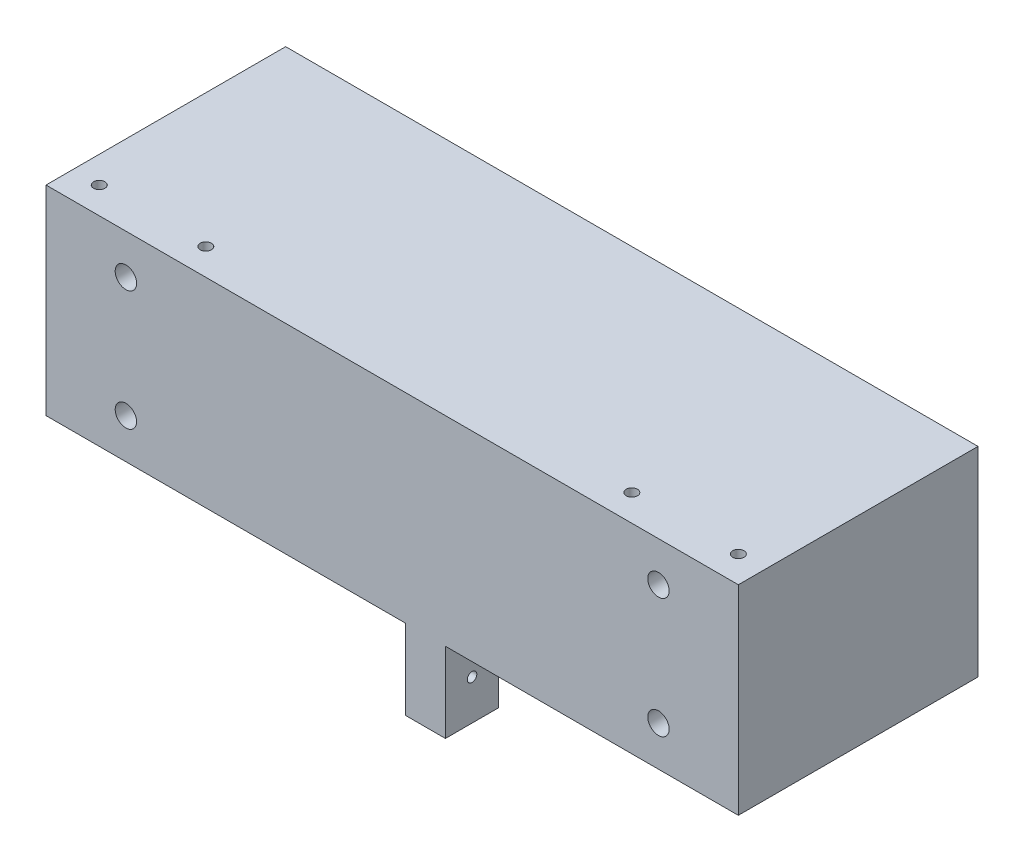
ISO-10303-21;
HEADER;
FILE_DESCRIPTION(('STEP AP214'),'2;1');
FILE_NAME('part.step','',(''),(''),'','','');
FILE_SCHEMA(('AUTOMOTIVE_DESIGN { 1 0 10303 214 1 1 1 1 }'));
ENDSEC;
DATA;
#1=APPLICATION_CONTEXT('core data for automotive mechanical design processes');
#2=APPLICATION_PROTOCOL_DEFINITION('international standard','automotive_design',2000,#1);
#3=PRODUCT_CONTEXT('',#1,'mechanical');
#4=PRODUCT('Part','Part','',(#3));
#5=PRODUCT_RELATED_PRODUCT_CATEGORY('part','',(#4));
#6=PRODUCT_DEFINITION_FORMATION('','',#4);
#7=PRODUCT_DEFINITION_CONTEXT('part definition',#1,'design');
#8=PRODUCT_DEFINITION('design','',#6,#7);
#9=PRODUCT_DEFINITION_SHAPE('','',#8);
#10=(LENGTH_UNIT() NAMED_UNIT(*) SI_UNIT(.MILLI.,.METRE.));
#11=(NAMED_UNIT(*) PLANE_ANGLE_UNIT() SI_UNIT($,.RADIAN.));
#12=(NAMED_UNIT(*) SI_UNIT($,.STERADIAN.) SOLID_ANGLE_UNIT());
#13=UNCERTAINTY_MEASURE_WITH_UNIT(LENGTH_MEASURE(1.E-05),#10,'distance_accuracy_value','');
#14=(GEOMETRIC_REPRESENTATION_CONTEXT(3) GLOBAL_UNCERTAINTY_ASSIGNED_CONTEXT((#13)) GLOBAL_UNIT_ASSIGNED_CONTEXT((#10,
#11,#12)) REPRESENTATION_CONTEXT('',''));
#15=CARTESIAN_POINT('',(0.,0.,0.));
#16=DIRECTION('',(0.,0.,1.));
#17=DIRECTION('',(1.,0.,0.));
#18=AXIS2_PLACEMENT_3D('',#15,#16,#17);
#19=CARTESIAN_POINT('',(-82.55,47.625,28.575));
#20=DIRECTION('',(-1.,0.,0.));
#21=DIRECTION('',(0.,0.,1.));
#22=AXIS2_PLACEMENT_3D('',#19,#20,#21);
#23=PLANE('',#22);
#24=DIRECTION('',(0.,0.,-1.));
#25=VECTOR('',#24,1.);
#26=CARTESIAN_POINT('',(-82.55,0.,28.575));
#27=LINE('',#26,#25);
#28=CARTESIAN_POINT('',(-82.55,0.,28.575));
#29=VERTEX_POINT('',#28);
#30=CARTESIAN_POINT('',(-82.55,0.,-28.575));
#31=VERTEX_POINT('',#30);
#32=EDGE_CURVE('E160',#29,#31,#27,.T.);
#33=ORIENTED_EDGE('',*,*,#32,.F.);
#34=DIRECTION('',(0.,-1.,0.));
#35=VECTOR('',#34,1.);
#36=CARTESIAN_POINT('',(-82.55,47.625,28.575));
#37=LINE('',#36,#35);
#38=CARTESIAN_POINT('',(-82.55,47.625,28.575));
#39=VERTEX_POINT('',#38);
#40=EDGE_CURVE('E11',#39,#29,#37,.T.);
#41=ORIENTED_EDGE('',*,*,#40,.F.);
#42=DIRECTION('',(0.,0.,-1.));
#43=VECTOR('',#42,1.);
#44=CARTESIAN_POINT('',(-82.55,47.625,28.575));
#45=LINE('',#44,#43);
#46=CARTESIAN_POINT('',(-82.55,47.625,-28.575));
#47=VERTEX_POINT('',#46);
#48=EDGE_CURVE('E166',#39,#47,#45,.T.);
#49=ORIENTED_EDGE('',*,*,#48,.T.);
#50=DIRECTION('',(0.,-1.,0.));
#51=VECTOR('',#50,1.);
#52=CARTESIAN_POINT('',(-82.55,47.625,-28.575));
#53=LINE('',#52,#51);
#54=EDGE_CURVE('E93',#47,#31,#53,.T.);
#55=ORIENTED_EDGE('',*,*,#54,.T.);
#56=EDGE_LOOP('',(#33,#41,#49,#55));
#57=FACE_BOUND('',#56,.T.);
#58=ADVANCED_FACE('F43',(#57),#23,.T.);
#59=CARTESIAN_POINT('',(-82.55,47.625,28.575));
#60=DIRECTION('',(0.,0.,-1.));
#61=DIRECTION('',(-1.,0.,0.));
#62=AXIS2_PLACEMENT_3D('',#59,#60,#61);
#63=PLANE('',#62);
#64=CARTESIAN_POINT('',(-63.5,38.1,28.575));
#65=DIRECTION('',(0.,0.,1.));
#66=DIRECTION('',(1.,0.,0.));
#67=AXIS2_PLACEMENT_3D('',#64,#65,#66);
#68=CIRCLE('',#67,2.55269999999999);
#69=CARTESIAN_POINT('',(-60.9473,38.1,28.575));
#70=VERTEX_POINT('',#69);
#71=EDGE_CURVE('E203',#70,#70,#68,.T.);
#72=ORIENTED_EDGE('',*,*,#71,.F.);
#73=EDGE_LOOP('',(#72));
#74=FACE_BOUND('',#73,.T.);
#75=CARTESIAN_POINT('',(-63.5,9.525,28.575));
#76=DIRECTION('',(0.,0.,1.));
#77=DIRECTION('',(1.,0.,0.));
#78=AXIS2_PLACEMENT_3D('',#75,#76,#77);
#79=CIRCLE('',#78,2.55269999999999);
#80=CARTESIAN_POINT('',(-60.9473,9.525,28.575));
#81=VERTEX_POINT('',#80);
#82=EDGE_CURVE('E225',#81,#81,#79,.T.);
#83=ORIENTED_EDGE('',*,*,#82,.F.);
#84=EDGE_LOOP('',(#83));
#85=FACE_BOUND('',#84,.T.);
#86=CARTESIAN_POINT('',(63.5,38.1,28.575));
#87=DIRECTION('',(0.,0.,1.));
#88=DIRECTION('',(1.,0.,0.));
#89=AXIS2_PLACEMENT_3D('',#86,#87,#88);
#90=CIRCLE('',#89,2.55269999999999);
#91=CARTESIAN_POINT('',(66.0527,38.1,28.575));
#92=VERTEX_POINT('',#91);
#93=EDGE_CURVE('E233',#92,#92,#90,.T.);
#94=ORIENTED_EDGE('',*,*,#93,.F.);
#95=EDGE_LOOP('',(#94));
#96=FACE_BOUND('',#95,.T.);
#97=CARTESIAN_POINT('',(63.5,9.525,28.575));
#98=DIRECTION('',(0.,0.,1.));
#99=DIRECTION('',(1.,0.,0.));
#100=AXIS2_PLACEMENT_3D('',#97,#98,#99);
#101=CIRCLE('',#100,2.55269999999999);
#102=CARTESIAN_POINT('',(66.0527,9.525,28.575));
#103=VERTEX_POINT('',#102);
#104=EDGE_CURVE('E241',#103,#103,#101,.T.);
#105=ORIENTED_EDGE('',*,*,#104,.F.);
#106=EDGE_LOOP('',(#105));
#107=FACE_BOUND('',#106,.T.);
#108=DIRECTION('',(1.,0.,0.));
#109=VECTOR('',#108,1.);
#110=CARTESIAN_POINT('',(-82.55,0.,28.575));
#111=LINE('',#110,#109);
#112=CARTESIAN_POINT('',(3.175,0.,28.575));
#113=VERTEX_POINT('',#112);
#114=EDGE_CURVE('E170',#29,#113,#111,.T.);
#115=ORIENTED_EDGE('',*,*,#114,.T.);
#116=DIRECTION('',(0.,-1.,0.));
#117=VECTOR('',#116,1.);
#118=CARTESIAN_POINT('',(3.175,0.,28.575));
#119=LINE('',#118,#117);
#120=CARTESIAN_POINT('',(3.175,-19.05,28.575));
#121=VERTEX_POINT('',#120);
#122=EDGE_CURVE('E60',#113,#121,#119,.T.);
#123=ORIENTED_EDGE('',*,*,#122,.T.);
#124=DIRECTION('',(1.,0.,0.));
#125=VECTOR('',#124,1.);
#126=CARTESIAN_POINT('',(3.175,-19.05,28.575));
#127=LINE('',#126,#125);
#128=CARTESIAN_POINT('',(12.7,-19.05,28.575));
#129=VERTEX_POINT('',#128);
#130=EDGE_CURVE('E122',#121,#129,#127,.T.);
#131=ORIENTED_EDGE('',*,*,#130,.T.);
#132=DIRECTION('',(0.,-1.,0.));
#133=VECTOR('',#132,1.);
#134=CARTESIAN_POINT('',(12.7,0.,28.575));
#135=LINE('',#134,#133);
#136=CARTESIAN_POINT('',(12.7,0.,28.575));
#137=VERTEX_POINT('',#136);
#138=EDGE_CURVE('E141',#137,#129,#135,.T.);
#139=ORIENTED_EDGE('',*,*,#138,.F.);
#140=CARTESIAN_POINT('',(82.55,0.,28.575));
#141=VERTEX_POINT('',#140);
#142=EDGE_CURVE('E190',#137,#141,#111,.T.);
#143=ORIENTED_EDGE('',*,*,#142,.T.);
#144=DIRECTION('',(0.,-1.,0.));
#145=VECTOR('',#144,1.);
#146=CARTESIAN_POINT('',(82.55,47.625,28.575));
#147=LINE('',#146,#145);
#148=CARTESIAN_POINT('',(82.55,47.625,28.575));
#149=VERTEX_POINT('',#148);
#150=EDGE_CURVE('E52',#149,#141,#147,.T.);
#151=ORIENTED_EDGE('',*,*,#150,.F.);
#152=DIRECTION('',(1.,0.,0.));
#153=VECTOR('',#152,1.);
#154=CARTESIAN_POINT('',(-82.55,47.625,28.575));
#155=LINE('',#154,#153);
#156=EDGE_CURVE('E176',#39,#149,#155,.T.);
#157=ORIENTED_EDGE('',*,*,#156,.F.);
#158=ORIENTED_EDGE('',*,*,#40,.T.);
#159=EDGE_LOOP('',(#115,#123,#131,#139,#143,#151,#157,#158));
#160=FACE_BOUND('',#159,.T.);
#161=ADVANCED_FACE('F275',(#74,#85,#96,#107,#160),#63,.F.);
#162=CARTESIAN_POINT('',(82.55,47.625,28.575));
#163=DIRECTION('',(-1.,0.,0.));
#164=DIRECTION('',(0.,0.,1.));
#165=AXIS2_PLACEMENT_3D('',#162,#163,#164);
#166=PLANE('',#165);
#167=DIRECTION('',(0.,0.,-1.));
#168=VECTOR('',#167,1.);
#169=CARTESIAN_POINT('',(82.55,0.,28.575));
#170=LINE('',#169,#168);
#171=CARTESIAN_POINT('',(82.55,0.,-28.575));
#172=VERTEX_POINT('',#171);
#173=EDGE_CURVE('E186',#141,#172,#170,.T.);
#174=ORIENTED_EDGE('',*,*,#173,.T.);
#175=DIRECTION('',(0.,-1.,0.));
#176=VECTOR('',#175,1.);
#177=CARTESIAN_POINT('',(82.55,47.625,-28.575));
#178=LINE('',#177,#176);
#179=CARTESIAN_POINT('',(82.55,47.625,-28.575));
#180=VERTEX_POINT('',#179);
#181=EDGE_CURVE('E196',#180,#172,#178,.T.);
#182=ORIENTED_EDGE('',*,*,#181,.F.);
#183=DIRECTION('',(0.,0.,-1.));
#184=VECTOR('',#183,1.);
#185=CARTESIAN_POINT('',(82.55,47.625,28.575));
#186=LINE('',#185,#184);
#187=EDGE_CURVE('E173',#149,#180,#186,.T.);
#188=ORIENTED_EDGE('',*,*,#187,.F.);
#189=ORIENTED_EDGE('',*,*,#150,.T.);
#190=EDGE_LOOP('',(#174,#182,#188,#189));
#191=FACE_BOUND('',#190,.T.);
#192=ADVANCED_FACE('F279',(#191),#166,.F.);
#193=CARTESIAN_POINT('',(-82.55,47.625,-28.575));
#194=DIRECTION('',(0.,0.,-1.));
#195=DIRECTION('',(-1.,0.,0.));
#196=AXIS2_PLACEMENT_3D('',#193,#194,#195);
#197=PLANE('',#196);
#198=CARTESIAN_POINT('',(-63.5,38.1,-28.575));
#199=DIRECTION('',(0.,0.,1.));
#200=DIRECTION('',(1.,0.,0.));
#201=AXIS2_PLACEMENT_3D('',#198,#199,#200);
#202=CIRCLE('',#201,2.55269999999999);
#203=CARTESIAN_POINT('',(-60.9473,38.1,-28.575));
#204=VERTEX_POINT('',#203);
#205=EDGE_CURVE('E210',#204,#204,#202,.T.);
#206=ORIENTED_EDGE('',*,*,#205,.T.);
#207=EDGE_LOOP('',(#206));
#208=FACE_BOUND('',#207,.T.);
#209=CARTESIAN_POINT('',(-63.5,9.525,-28.575));
#210=DIRECTION('',(0.,0.,1.));
#211=DIRECTION('',(1.,0.,0.));
#212=AXIS2_PLACEMENT_3D('',#209,#210,#211);
#213=CIRCLE('',#212,2.55269999999999);
#214=CARTESIAN_POINT('',(-60.9473,9.525,-28.575));
#215=VERTEX_POINT('',#214);
#216=EDGE_CURVE('E229',#215,#215,#213,.T.);
#217=ORIENTED_EDGE('',*,*,#216,.T.);
#218=EDGE_LOOP('',(#217));
#219=FACE_BOUND('',#218,.T.);
#220=CARTESIAN_POINT('',(63.5,38.1,-28.575));
#221=DIRECTION('',(0.,0.,1.));
#222=DIRECTION('',(1.,0.,0.));
#223=AXIS2_PLACEMENT_3D('',#220,#221,#222);
#224=CIRCLE('',#223,2.55269999999999);
#225=CARTESIAN_POINT('',(66.0527,38.1,-28.575));
#226=VERTEX_POINT('',#225);
#227=EDGE_CURVE('E237',#226,#226,#224,.T.);
#228=ORIENTED_EDGE('',*,*,#227,.T.);
#229=EDGE_LOOP('',(#228));
#230=FACE_BOUND('',#229,.T.);
#231=CARTESIAN_POINT('',(63.5,9.525,-28.575));
#232=DIRECTION('',(0.,0.,1.));
#233=DIRECTION('',(1.,0.,0.));
#234=AXIS2_PLACEMENT_3D('',#231,#232,#233);
#235=CIRCLE('',#234,2.55269999999999);
#236=CARTESIAN_POINT('',(66.0527,9.525,-28.575));
#237=VERTEX_POINT('',#236);
#238=EDGE_CURVE('E245',#237,#237,#235,.T.);
#239=ORIENTED_EDGE('',*,*,#238,.T.);
#240=EDGE_LOOP('',(#239));
#241=FACE_BOUND('',#240,.T.);
#242=DIRECTION('',(1.,0.,0.));
#243=VECTOR('',#242,1.);
#244=CARTESIAN_POINT('',(-82.55,0.,-28.575));
#245=LINE('',#244,#243);
#246=EDGE_CURVE('E182',#31,#172,#245,.T.);
#247=ORIENTED_EDGE('',*,*,#246,.F.);
#248=ORIENTED_EDGE('',*,*,#54,.F.);
#249=DIRECTION('',(1.,0.,0.));
#250=VECTOR('',#249,1.);
#251=CARTESIAN_POINT('',(-82.55,47.625,-28.575));
#252=LINE('',#251,#250);
#253=EDGE_CURVE('E169',#47,#180,#252,.T.);
#254=ORIENTED_EDGE('',*,*,#253,.T.);
#255=ORIENTED_EDGE('',*,*,#181,.T.);
#256=EDGE_LOOP('',(#247,#248,#254,#255));
#257=FACE_BOUND('',#256,.T.);
#258=ADVANCED_FACE('F295',(#208,#219,#230,#241,#257),#197,.T.);
#259=CARTESIAN_POINT('',(0.,47.625,0.));
#260=DIRECTION('',(0.,-1.,0.));
#261=DIRECTION('',(0.,0.,-1.));
#262=AXIS2_PLACEMENT_3D('',#259,#260,#261);
#263=PLANE('',#262);
#264=CARTESIAN_POINT('',(-76.2,47.625,22.225));
#265=DIRECTION('',(0.,1.,0.));
#266=DIRECTION('',(0.,0.,1.));
#267=AXIS2_PLACEMENT_3D('',#264,#265,#266);
#268=CIRCLE('',#267,1.35254999999999);
#269=CARTESIAN_POINT('',(-76.2,47.625,23.57755));
#270=VERTEX_POINT('',#269);
#271=EDGE_CURVE('E500',#270,#270,#268,.T.);
#272=ORIENTED_EDGE('',*,*,#271,.F.);
#273=EDGE_LOOP('',(#272));
#274=FACE_BOUND('',#273,.T.);
#275=CARTESIAN_POINT('',(-50.8,47.625,22.225));
#276=DIRECTION('',(0.,1.,0.));
#277=DIRECTION('',(0.,0.,1.));
#278=AXIS2_PLACEMENT_3D('',#275,#276,#277);
#279=CIRCLE('',#278,1.35255);
#280=CARTESIAN_POINT('',(-50.8,47.625,23.57755));
#281=VERTEX_POINT('',#280);
#282=EDGE_CURVE('E490',#281,#281,#279,.T.);
#283=ORIENTED_EDGE('',*,*,#282,.F.);
#284=EDGE_LOOP('',(#283));
#285=FACE_BOUND('',#284,.T.);
#286=CARTESIAN_POINT('',(50.8,47.625,22.225));
#287=DIRECTION('',(0.,1.,0.));
#288=DIRECTION('',(0.,0.,1.));
#289=AXIS2_PLACEMENT_3D('',#286,#287,#288);
#290=CIRCLE('',#289,1.35255);
#291=CARTESIAN_POINT('',(50.8,47.625,23.57755));
#292=VERTEX_POINT('',#291);
#293=EDGE_CURVE('E218',#292,#292,#290,.T.);
#294=ORIENTED_EDGE('',*,*,#293,.F.);
#295=EDGE_LOOP('',(#294));
#296=FACE_BOUND('',#295,.T.);
#297=CARTESIAN_POINT('',(76.2,47.625,22.225));
#298=DIRECTION('',(0.,1.,0.));
#299=DIRECTION('',(0.,0.,1.));
#300=AXIS2_PLACEMENT_3D('',#297,#298,#299);
#301=CIRCLE('',#300,1.35254999999999);
#302=CARTESIAN_POINT('',(76.2,47.625,23.57755));
#303=VERTEX_POINT('',#302);
#304=EDGE_CURVE('E204',#303,#303,#301,.T.);
#305=ORIENTED_EDGE('',*,*,#304,.F.);
#306=EDGE_LOOP('',(#305));
#307=FACE_BOUND('',#306,.T.);
#308=ORIENTED_EDGE('',*,*,#48,.F.);
#309=ORIENTED_EDGE('',*,*,#156,.T.);
#310=ORIENTED_EDGE('',*,*,#187,.T.);
#311=ORIENTED_EDGE('',*,*,#253,.F.);
#312=EDGE_LOOP('',(#308,#309,#310,#311));
#313=FACE_BOUND('',#312,.T.);
#314=ADVANCED_FACE('F269',(#274,#285,#296,#307,#313),#263,.F.);
#315=CARTESIAN_POINT('',(0.,0.,0.));
#316=DIRECTION('',(0.,-1.,0.));
#317=DIRECTION('',(0.,0.,-1.));
#318=AXIS2_PLACEMENT_3D('',#315,#316,#317);
#319=PLANE('',#318);
#320=CARTESIAN_POINT('',(-76.2,0.,22.225));
#321=DIRECTION('',(0.,-1.,0.));
#322=DIRECTION('',(0.,0.,-1.));
#323=AXIS2_PLACEMENT_3D('',#320,#321,#322);
#324=CIRCLE('',#323,1.35254999999999);
#325=CARTESIAN_POINT('',(-76.2,0.,20.87245));
#326=VERTEX_POINT('',#325);
#327=EDGE_CURVE('E494',#326,#326,#324,.T.);
#328=ORIENTED_EDGE('',*,*,#327,.F.);
#329=EDGE_LOOP('',(#328));
#330=FACE_BOUND('',#329,.T.);
#331=CARTESIAN_POINT('',(-50.8,0.,22.225));
#332=DIRECTION('',(0.,-1.,0.));
#333=DIRECTION('',(0.,0.,-1.));
#334=AXIS2_PLACEMENT_3D('',#331,#332,#333);
#335=CIRCLE('',#334,1.35254999999999);
#336=CARTESIAN_POINT('',(-50.8,0.,20.87245));
#337=VERTEX_POINT('',#336);
#338=EDGE_CURVE('E487',#337,#337,#335,.T.);
#339=ORIENTED_EDGE('',*,*,#338,.F.);
#340=EDGE_LOOP('',(#339));
#341=FACE_BOUND('',#340,.T.);
#342=CARTESIAN_POINT('',(50.8,0.,22.225));
#343=DIRECTION('',(0.,-1.,0.));
#344=DIRECTION('',(0.,0.,-1.));
#345=AXIS2_PLACEMENT_3D('',#342,#343,#344);
#346=CIRCLE('',#345,1.35254999999999);
#347=CARTESIAN_POINT('',(50.8,0.,20.87245));
#348=VERTEX_POINT('',#347);
#349=EDGE_CURVE('E46',#348,#348,#346,.T.);
#350=ORIENTED_EDGE('',*,*,#349,.F.);
#351=EDGE_LOOP('',(#350));
#352=FACE_BOUND('',#351,.T.);
#353=CARTESIAN_POINT('',(76.2,0.,22.225));
#354=DIRECTION('',(0.,-1.,0.));
#355=DIRECTION('',(0.,0.,-1.));
#356=AXIS2_PLACEMENT_3D('',#353,#354,#355);
#357=CIRCLE('',#356,1.35254999999999);
#358=CARTESIAN_POINT('',(76.2,0.,20.87245));
#359=VERTEX_POINT('',#358);
#360=EDGE_CURVE('E200',#359,#359,#357,.T.);
#361=ORIENTED_EDGE('',*,*,#360,.F.);
#362=EDGE_LOOP('',(#361));
#363=FACE_BOUND('',#362,.T.);
#364=DIRECTION('',(0.,0.,1.));
#365=VECTOR('',#364,1.);
#366=CARTESIAN_POINT('',(12.7,0.,15.875));
#367=LINE('',#366,#365);
#368=CARTESIAN_POINT('',(12.7,0.,15.875));
#369=VERTEX_POINT('',#368);
#370=EDGE_CURVE('E161',#369,#137,#367,.T.);
#371=ORIENTED_EDGE('',*,*,#370,.F.);
#372=DIRECTION('',(1.,0.,0.));
#373=VECTOR('',#372,1.);
#374=CARTESIAN_POINT('',(3.175,0.,15.875));
#375=LINE('',#374,#373);
#376=CARTESIAN_POINT('',(3.175,0.,15.875));
#377=VERTEX_POINT('',#376);
#378=EDGE_CURVE('E126',#377,#369,#375,.T.);
#379=ORIENTED_EDGE('',*,*,#378,.F.);
#380=DIRECTION('',(0.,0.,1.));
#381=VECTOR('',#380,1.);
#382=CARTESIAN_POINT('',(3.175,0.,15.875));
#383=LINE('',#382,#381);
#384=EDGE_CURVE('E139',#377,#113,#383,.T.);
#385=ORIENTED_EDGE('',*,*,#384,.T.);
#386=ORIENTED_EDGE('',*,*,#114,.F.);
#387=ORIENTED_EDGE('',*,*,#32,.T.);
#388=ORIENTED_EDGE('',*,*,#246,.T.);
#389=ORIENTED_EDGE('',*,*,#173,.F.);
#390=ORIENTED_EDGE('',*,*,#142,.F.);
#391=EDGE_LOOP('',(#371,#379,#385,#386,#387,#388,#389,#390));
#392=FACE_BOUND('',#391,.T.);
#393=ADVANCED_FACE('F261',(#330,#341,#352,#363,#392),#319,.T.);
#394=CARTESIAN_POINT('',(3.175,0.,15.875));
#395=DIRECTION('',(-1.,0.,0.));
#396=DIRECTION('',(0.,-1.,0.));
#397=AXIS2_PLACEMENT_3D('',#394,#395,#396);
#398=PLANE('',#397);
#399=CARTESIAN_POINT('',(3.175,-9.525,22.225));
#400=DIRECTION('',(-1.,0.,0.));
#401=DIRECTION('',(0.,-1.,0.));
#402=AXIS2_PLACEMENT_3D('',#399,#400,#401);
#403=CIRCLE('',#402,1.13029999999999);
#404=CARTESIAN_POINT('',(3.175,-10.6553,22.225));
#405=VERTEX_POINT('',#404);
#406=EDGE_CURVE('E147',#405,#405,#403,.T.);
#407=ORIENTED_EDGE('',*,*,#406,.F.);
#408=EDGE_LOOP('',(#407));
#409=FACE_BOUND('',#408,.T.);
#410=ORIENTED_EDGE('',*,*,#122,.F.);
#411=ORIENTED_EDGE('',*,*,#384,.F.);
#412=DIRECTION('',(0.,-1.,0.));
#413=VECTOR('',#412,1.);
#414=CARTESIAN_POINT('',(3.175,0.,15.875));
#415=LINE('',#414,#413);
#416=CARTESIAN_POINT('',(3.175,-19.05,15.875));
#417=VERTEX_POINT('',#416);
#418=EDGE_CURVE('E131',#377,#417,#415,.T.);
#419=ORIENTED_EDGE('',*,*,#418,.T.);
#420=DIRECTION('',(0.,0.,1.));
#421=VECTOR('',#420,1.);
#422=CARTESIAN_POINT('',(3.175,-19.05,15.875));
#423=LINE('',#422,#421);
#424=EDGE_CURVE('E117',#417,#121,#423,.T.);
#425=ORIENTED_EDGE('',*,*,#424,.T.);
#426=EDGE_LOOP('',(#410,#411,#419,#425));
#427=FACE_BOUND('',#426,.T.);
#428=ADVANCED_FACE('F138',(#409,#427),#398,.T.);
#429=CARTESIAN_POINT('',(12.7,0.,15.875));
#430=DIRECTION('',(-1.,0.,0.));
#431=DIRECTION('',(0.,-1.,0.));
#432=AXIS2_PLACEMENT_3D('',#429,#430,#431);
#433=PLANE('',#432);
#434=CARTESIAN_POINT('',(12.7,-9.525,22.225));
#435=DIRECTION('',(1.,0.,0.));
#436=DIRECTION('',(0.,0.,-1.));
#437=AXIS2_PLACEMENT_3D('',#434,#435,#436);
#438=CIRCLE('',#437,1.1303);
#439=CARTESIAN_POINT('',(12.7,-9.525,21.0947));
#440=VERTEX_POINT('',#439);
#441=EDGE_CURVE('E248',#440,#440,#438,.T.);
#442=ORIENTED_EDGE('',*,*,#441,.F.);
#443=EDGE_LOOP('',(#442));
#444=FACE_BOUND('',#443,.T.);
#445=ORIENTED_EDGE('',*,*,#138,.T.);
#446=DIRECTION('',(0.,0.,1.));
#447=VECTOR('',#446,1.);
#448=CARTESIAN_POINT('',(12.7,-19.05,15.875));
#449=LINE('',#448,#447);
#450=CARTESIAN_POINT('',(12.7,-19.05,15.875));
#451=VERTEX_POINT('',#450);
#452=EDGE_CURVE('E125',#451,#129,#449,.T.);
#453=ORIENTED_EDGE('',*,*,#452,.F.);
#454=DIRECTION('',(0.,-1.,0.));
#455=VECTOR('',#454,1.);
#456=CARTESIAN_POINT('',(12.7,0.,15.875));
#457=LINE('',#456,#455);
#458=EDGE_CURVE('E134',#369,#451,#457,.T.);
#459=ORIENTED_EDGE('',*,*,#458,.F.);
#460=ORIENTED_EDGE('',*,*,#370,.T.);
#461=EDGE_LOOP('',(#445,#453,#459,#460));
#462=FACE_BOUND('',#461,.T.);
#463=ADVANCED_FACE('F260',(#444,#462),#433,.F.);
#464=CARTESIAN_POINT('',(3.175,-19.05,15.875));
#465=DIRECTION('',(0.,-1.,0.));
#466=DIRECTION('',(1.,0.,0.));
#467=AXIS2_PLACEMENT_3D('',#464,#465,#466);
#468=PLANE('',#467);
#469=ORIENTED_EDGE('',*,*,#130,.F.);
#470=ORIENTED_EDGE('',*,*,#424,.F.);
#471=DIRECTION('',(1.,0.,0.));
#472=VECTOR('',#471,1.);
#473=CARTESIAN_POINT('',(3.175,-19.05,15.875));
#474=LINE('',#473,#472);
#475=EDGE_CURVE('E120',#417,#451,#474,.T.);
#476=ORIENTED_EDGE('',*,*,#475,.T.);
#477=ORIENTED_EDGE('',*,*,#452,.T.);
#478=EDGE_LOOP('',(#469,#470,#476,#477));
#479=FACE_BOUND('',#478,.T.);
#480=ADVANCED_FACE('F119',(#479),#468,.T.);
#481=CARTESIAN_POINT('',(0.,0.,15.875));
#482=DIRECTION('',(0.,0.,1.));
#483=DIRECTION('',(1.,0.,0.));
#484=AXIS2_PLACEMENT_3D('',#481,#482,#483);
#485=PLANE('',#484);
#486=ORIENTED_EDGE('',*,*,#418,.F.);
#487=ORIENTED_EDGE('',*,*,#378,.T.);
#488=ORIENTED_EDGE('',*,*,#458,.T.);
#489=ORIENTED_EDGE('',*,*,#475,.F.);
#490=EDGE_LOOP('',(#486,#487,#488,#489));
#491=FACE_BOUND('',#490,.T.);
#492=ADVANCED_FACE('F130',(#491),#485,.F.);
#493=CARTESIAN_POINT('',(12.7,-9.525,22.225));
#494=DIRECTION('',(1.,0.,0.));
#495=DIRECTION('',(0.,0.,-1.));
#496=AXIS2_PLACEMENT_3D('',#493,#494,#495);
#497=CYLINDRICAL_SURFACE('',#496,1.13029999999999);
#498=ORIENTED_EDGE('',*,*,#406,.T.);
#499=EDGE_LOOP('',(#498));
#500=FACE_BOUND('',#499,.T.);
#501=ORIENTED_EDGE('',*,*,#441,.T.);
#502=EDGE_LOOP('',(#501));
#503=FACE_BOUND('',#502,.T.);
#504=ADVANCED_FACE('F257',(#500,#503),#497,.F.);
#505=CARTESIAN_POINT('',(63.5,9.525,28.575));
#506=DIRECTION('',(0.,0.,1.));
#507=DIRECTION('',(1.,0.,0.));
#508=AXIS2_PLACEMENT_3D('',#505,#506,#507);
#509=CYLINDRICAL_SURFACE('',#508,2.55269999999999);
#510=ORIENTED_EDGE('',*,*,#238,.F.);
#511=EDGE_LOOP('',(#510));
#512=FACE_BOUND('',#511,.T.);
#513=ORIENTED_EDGE('',*,*,#104,.T.);
#514=EDGE_LOOP('',(#513));
#515=FACE_BOUND('',#514,.T.);
#516=ADVANCED_FACE('F312',(#512,#515),#509,.F.);
#517=CARTESIAN_POINT('',(63.5,38.1,28.575));
#518=DIRECTION('',(0.,0.,1.));
#519=DIRECTION('',(1.,0.,0.));
#520=AXIS2_PLACEMENT_3D('',#517,#518,#519);
#521=CYLINDRICAL_SURFACE('',#520,2.55269999999999);
#522=ORIENTED_EDGE('',*,*,#227,.F.);
#523=EDGE_LOOP('',(#522));
#524=FACE_BOUND('',#523,.T.);
#525=ORIENTED_EDGE('',*,*,#93,.T.);
#526=EDGE_LOOP('',(#525));
#527=FACE_BOUND('',#526,.T.);
#528=ADVANCED_FACE('F315',(#524,#527),#521,.F.);
#529=CARTESIAN_POINT('',(-63.5,9.525,28.575));
#530=DIRECTION('',(0.,0.,1.));
#531=DIRECTION('',(1.,0.,0.));
#532=AXIS2_PLACEMENT_3D('',#529,#530,#531);
#533=CYLINDRICAL_SURFACE('',#532,2.55269999999999);
#534=ORIENTED_EDGE('',*,*,#216,.F.);
#535=EDGE_LOOP('',(#534));
#536=FACE_BOUND('',#535,.T.);
#537=ORIENTED_EDGE('',*,*,#82,.T.);
#538=EDGE_LOOP('',(#537));
#539=FACE_BOUND('',#538,.T.);
#540=ADVANCED_FACE('F323',(#536,#539),#533,.F.);
#541=CARTESIAN_POINT('',(-63.5,38.1,28.575));
#542=DIRECTION('',(0.,0.,1.));
#543=DIRECTION('',(1.,0.,0.));
#544=AXIS2_PLACEMENT_3D('',#541,#542,#543);
#545=CYLINDRICAL_SURFACE('',#544,2.55269999999999);
#546=ORIENTED_EDGE('',*,*,#205,.F.);
#547=EDGE_LOOP('',(#546));
#548=FACE_BOUND('',#547,.T.);
#549=ORIENTED_EDGE('',*,*,#71,.T.);
#550=EDGE_LOOP('',(#549));
#551=FACE_BOUND('',#550,.T.);
#552=ADVANCED_FACE('F352',(#548,#551),#545,.F.);
#553=CARTESIAN_POINT('',(76.2,47.625,22.225));
#554=DIRECTION('',(0.,1.,0.));
#555=DIRECTION('',(0.,0.,1.));
#556=AXIS2_PLACEMENT_3D('',#553,#554,#555);
#557=CYLINDRICAL_SURFACE('',#556,1.35254999999999);
#558=ORIENTED_EDGE('',*,*,#360,.T.);
#559=EDGE_LOOP('',(#558));
#560=FACE_BOUND('',#559,.T.);
#561=ORIENTED_EDGE('',*,*,#304,.T.);
#562=EDGE_LOOP('',(#561));
#563=FACE_BOUND('',#562,.T.);
#564=ADVANCED_FACE('F357',(#560,#563),#557,.F.);
#565=CARTESIAN_POINT('',(50.8,47.625,22.225));
#566=DIRECTION('',(0.,1.,0.));
#567=DIRECTION('',(0.,0.,1.));
#568=AXIS2_PLACEMENT_3D('',#565,#566,#567);
#569=CYLINDRICAL_SURFACE('',#568,1.35254999999999);
#570=ORIENTED_EDGE('',*,*,#349,.T.);
#571=EDGE_LOOP('',(#570));
#572=FACE_BOUND('',#571,.T.);
#573=ORIENTED_EDGE('',*,*,#293,.T.);
#574=EDGE_LOOP('',(#573));
#575=FACE_BOUND('',#574,.T.);
#576=ADVANCED_FACE('F398',(#572,#575),#569,.F.);
#577=CARTESIAN_POINT('',(-50.8,47.625,22.225));
#578=DIRECTION('',(0.,1.,0.));
#579=DIRECTION('',(0.,0.,1.));
#580=AXIS2_PLACEMENT_3D('',#577,#578,#579);
#581=CYLINDRICAL_SURFACE('',#580,1.35254999999999);
#582=ORIENTED_EDGE('',*,*,#338,.T.);
#583=EDGE_LOOP('',(#582));
#584=FACE_BOUND('',#583,.T.);
#585=ORIENTED_EDGE('',*,*,#282,.T.);
#586=EDGE_LOOP('',(#585));
#587=FACE_BOUND('',#586,.T.);
#588=ADVANCED_FACE('F388',(#584,#587),#581,.F.);
#589=CARTESIAN_POINT('',(-76.2,47.625,22.225));
#590=DIRECTION('',(0.,1.,0.));
#591=DIRECTION('',(0.,0.,1.));
#592=AXIS2_PLACEMENT_3D('',#589,#590,#591);
#593=CYLINDRICAL_SURFACE('',#592,1.35254999999999);
#594=ORIENTED_EDGE('',*,*,#327,.T.);
#595=EDGE_LOOP('',(#594));
#596=FACE_BOUND('',#595,.T.);
#597=ORIENTED_EDGE('',*,*,#271,.T.);
#598=EDGE_LOOP('',(#597));
#599=FACE_BOUND('',#598,.T.);
#600=ADVANCED_FACE('F383',(#596,#599),#593,.F.);
#601=CLOSED_SHELL('',(#58,#161,#192,#258,#314,#393,#428,#463,#480,#492,#504,#516,#528,#540,#552,
#564,#576,#588,#600));
#602=MANIFOLD_SOLID_BREP('B2',#601);
#603=ADVANCED_BREP_SHAPE_REPRESENTATION('',(#18,#602),#14);
#604=SHAPE_DEFINITION_REPRESENTATION(#9,#603);
ENDSEC;
END-ISO-10303-21;
